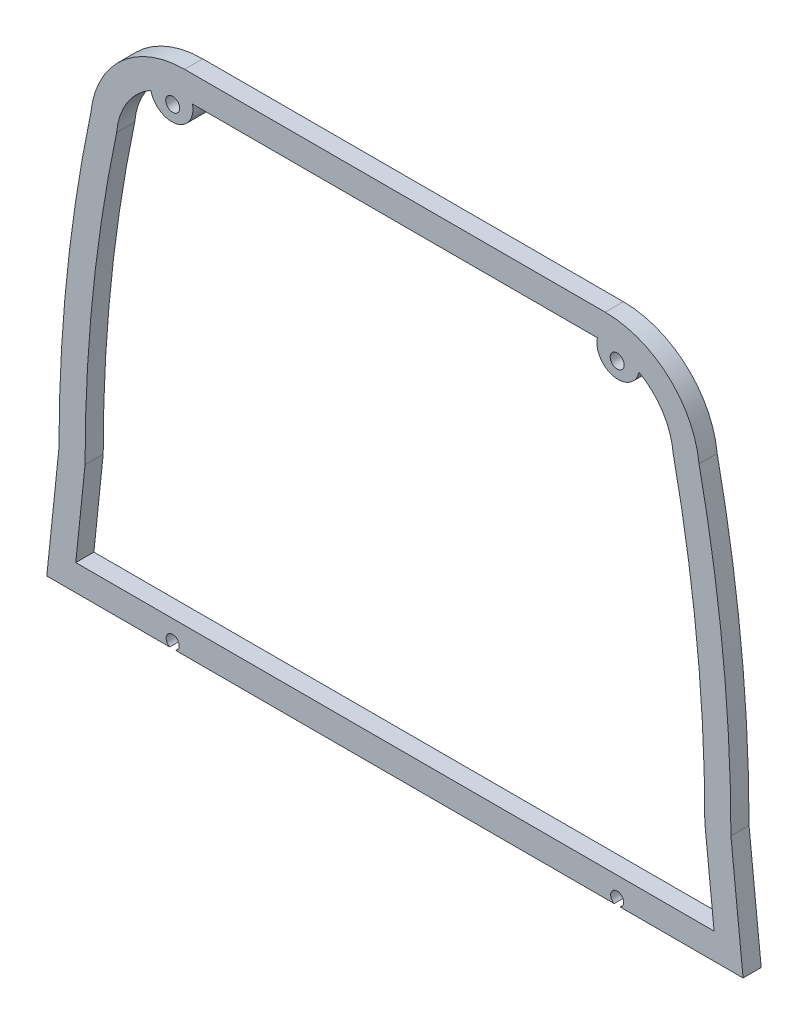
ISO-10303-21;
HEADER;
FILE_DESCRIPTION(('STEP AP214'),'2;1');
FILE_NAME('part.step','',(''),(''),'','','');
FILE_SCHEMA(('AUTOMOTIVE_DESIGN { 1 0 10303 214 1 1 1 1 }'));
ENDSEC;
DATA;
#1=APPLICATION_CONTEXT('core data for automotive mechanical design processes');
#2=APPLICATION_PROTOCOL_DEFINITION('international standard','automotive_design',2000,#1);
#3=PRODUCT_CONTEXT('',#1,'mechanical');
#4=PRODUCT('Part','Part','',(#3));
#5=PRODUCT_RELATED_PRODUCT_CATEGORY('part','',(#4));
#6=PRODUCT_DEFINITION_FORMATION('','',#4);
#7=PRODUCT_DEFINITION_CONTEXT('part definition',#1,'design');
#8=PRODUCT_DEFINITION('design','',#6,#7);
#9=PRODUCT_DEFINITION_SHAPE('','',#8);
#10=(LENGTH_UNIT() NAMED_UNIT(*) SI_UNIT(.MILLI.,.METRE.));
#11=(NAMED_UNIT(*) PLANE_ANGLE_UNIT() SI_UNIT($,.RADIAN.));
#12=(NAMED_UNIT(*) SI_UNIT($,.STERADIAN.) SOLID_ANGLE_UNIT());
#13=UNCERTAINTY_MEASURE_WITH_UNIT(LENGTH_MEASURE(1.E-05),#10,'distance_accuracy_value','');
#14=(GEOMETRIC_REPRESENTATION_CONTEXT(3) GLOBAL_UNCERTAINTY_ASSIGNED_CONTEXT((#13)) GLOBAL_UNIT_ASSIGNED_CONTEXT((#10,
#11,#12)) REPRESENTATION_CONTEXT('',''));
#15=CARTESIAN_POINT('',(0.,0.,0.));
#16=DIRECTION('',(0.,0.,1.));
#17=DIRECTION('',(1.,0.,0.));
#18=AXIS2_PLACEMENT_3D('',#15,#16,#17);
#19=CARTESIAN_POINT('',(0.,-22.225,1.5875));
#20=DIRECTION('',(0.,1.,0.));
#21=DIRECTION('',(-1.,0.,0.));
#22=AXIS2_PLACEMENT_3D('',#19,#20,#21);
#23=PLANE('',#22);
#24=DIRECTION('',(1.,0.,0.));
#25=VECTOR('',#24,1.);
#26=CARTESIAN_POINT('',(0.,-22.225,0.));
#27=LINE('',#26,#25);
#28=CARTESIAN_POINT('',(-30.48,-22.225,0.));
#29=VERTEX_POINT('',#28);
#30=CARTESIAN_POINT('',(-19.719346062449,-22.225,0.));
#31=VERTEX_POINT('',#30);
#32=EDGE_CURVE('E260',#29,#31,#27,.T.);
#33=ORIENTED_EDGE('',*,*,#32,.T.);
#34=DIRECTION('',(0.,0.,-1.));
#35=VECTOR('',#34,1.);
#36=CARTESIAN_POINT('',(-19.719346062449,-22.225,1.5875));
#37=LINE('',#36,#35);
#38=CARTESIAN_POINT('',(-19.719346062449,-22.225,1.5875));
#39=VERTEX_POINT('',#38);
#40=EDGE_CURVE('E11',#39,#31,#37,.T.);
#41=ORIENTED_EDGE('',*,*,#40,.F.);
#42=DIRECTION('',(1.,0.,0.));
#43=VECTOR('',#42,1.);
#44=CARTESIAN_POINT('',(0.,-22.225,1.5875));
#45=LINE('',#44,#43);
#46=CARTESIAN_POINT('',(-30.48,-22.225,1.5875));
#47=VERTEX_POINT('',#46);
#48=EDGE_CURVE('E430',#47,#39,#45,.T.);
#49=ORIENTED_EDGE('',*,*,#48,.F.);
#50=DIRECTION('',(0.,0.,-1.));
#51=VECTOR('',#50,1.);
#52=CARTESIAN_POINT('',(-30.48,-22.225,1.5875));
#53=LINE('',#52,#51);
#54=EDGE_CURVE('E292',#47,#29,#53,.T.);
#55=ORIENTED_EDGE('',*,*,#54,.T.);
#56=EDGE_LOOP('',(#33,#41,#49,#55));
#57=FACE_BOUND('',#56,.T.);
#58=ADVANCED_FACE('F39',(#57),#23,.F.);
#59=CARTESIAN_POINT('',(-19.4575288552222,-21.717,1.5875));
#60=DIRECTION('',(0.,0.,-1.));
#61=DIRECTION('',(-1.,0.,0.));
#62=AXIS2_PLACEMENT_3D('',#59,#60,#61);
#63=CYLINDRICAL_SURFACE('',#62,0.571499999999999);
#64=CARTESIAN_POINT('',(-19.4575288552222,-21.717,0.));
#65=DIRECTION('',(0.,0.,1.));
#66=DIRECTION('',(1.,0.,0.));
#67=AXIS2_PLACEMENT_3D('',#64,#65,#66);
#68=CIRCLE('',#67,0.571499999999999);
#69=CARTESIAN_POINT('',(-19.1957116479955,-22.225,0.));
#70=VERTEX_POINT('',#69);
#71=EDGE_CURVE('E263',#31,#70,#68,.F.);
#72=ORIENTED_EDGE('',*,*,#71,.T.);
#73=DIRECTION('',(0.,0.,-1.));
#74=VECTOR('',#73,1.);
#75=CARTESIAN_POINT('',(-19.1957116479955,-22.225,1.5875));
#76=LINE('',#75,#74);
#77=CARTESIAN_POINT('',(-19.1957116479955,-22.225,1.5875));
#78=VERTEX_POINT('',#77);
#79=EDGE_CURVE('E49',#78,#70,#76,.T.);
#80=ORIENTED_EDGE('',*,*,#79,.F.);
#81=CARTESIAN_POINT('',(-19.4575288552222,-21.717,1.5875));
#82=DIRECTION('',(0.,0.,1.));
#83=DIRECTION('',(1.,0.,0.));
#84=AXIS2_PLACEMENT_3D('',#81,#82,#83);
#85=CIRCLE('',#84,0.571499999999999);
#86=EDGE_CURVE('E628',#39,#78,#85,.F.);
#87=ORIENTED_EDGE('',*,*,#86,.F.);
#88=ORIENTED_EDGE('',*,*,#40,.T.);
#89=EDGE_LOOP('',(#72,#80,#87,#88));
#90=FACE_BOUND('',#89,.T.);
#91=ADVANCED_FACE('F384',(#90),#63,.F.);
#92=CARTESIAN_POINT('',(19.1957116479961,-22.225,0.));
#93=VERTEX_POINT('',#92);
#94=EDGE_CURVE('E265',#70,#93,#27,.T.);
#95=ORIENTED_EDGE('',*,*,#94,.T.);
#96=DIRECTION('',(0.,0.,-1.));
#97=VECTOR('',#96,1.);
#98=CARTESIAN_POINT('',(19.1957116479961,-22.225,1.5875));
#99=LINE('',#98,#97);
#100=CARTESIAN_POINT('',(19.1957116479961,-22.225,1.5875));
#101=VERTEX_POINT('',#100);
#102=EDGE_CURVE('E306',#101,#93,#99,.T.);
#103=ORIENTED_EDGE('',*,*,#102,.F.);
#104=EDGE_CURVE('E429',#78,#101,#45,.T.);
#105=ORIENTED_EDGE('',*,*,#104,.F.);
#106=ORIENTED_EDGE('',*,*,#79,.T.);
#107=EDGE_LOOP('',(#95,#103,#105,#106));
#108=FACE_BOUND('',#107,.T.);
#109=ADVANCED_FACE('F387',(#108),#23,.F.);
#110=CARTESIAN_POINT('',(19.4575288552225,-21.7169999999999,1.5875));
#111=DIRECTION('',(0.,0.,-1.));
#112=DIRECTION('',(-1.,0.,0.));
#113=AXIS2_PLACEMENT_3D('',#110,#111,#112);
#114=CYLINDRICAL_SURFACE('',#113,0.571499999999999);
#115=CARTESIAN_POINT('',(19.4575288552225,-21.7169999999999,0.));
#116=DIRECTION('',(0.,0.,1.));
#117=DIRECTION('',(1.,0.,0.));
#118=AXIS2_PLACEMENT_3D('',#115,#116,#117);
#119=CIRCLE('',#118,0.571499999999999);
#120=CARTESIAN_POINT('',(19.719346062449,-22.225,0.));
#121=VERTEX_POINT('',#120);
#122=EDGE_CURVE('E267',#121,#93,#119,.T.);
#123=ORIENTED_EDGE('',*,*,#122,.F.);
#124=DIRECTION('',(0.,0.,-1.));
#125=VECTOR('',#124,1.);
#126=CARTESIAN_POINT('',(19.719346062449,-22.225,1.5875));
#127=LINE('',#126,#125);
#128=CARTESIAN_POINT('',(19.719346062449,-22.225,1.5875));
#129=VERTEX_POINT('',#128);
#130=EDGE_CURVE('E304',#129,#121,#127,.T.);
#131=ORIENTED_EDGE('',*,*,#130,.F.);
#132=CARTESIAN_POINT('',(19.4575288552225,-21.7169999999999,1.5875));
#133=DIRECTION('',(0.,0.,1.));
#134=DIRECTION('',(1.,0.,0.));
#135=AXIS2_PLACEMENT_3D('',#132,#133,#134);
#136=CIRCLE('',#135,0.571499999999999);
#137=EDGE_CURVE('E427',#129,#101,#136,.T.);
#138=ORIENTED_EDGE('',*,*,#137,.T.);
#139=ORIENTED_EDGE('',*,*,#102,.T.);
#140=EDGE_LOOP('',(#123,#131,#138,#139));
#141=FACE_BOUND('',#140,.T.);
#142=ADVANCED_FACE('F397',(#141),#114,.F.);
#143=CARTESIAN_POINT('',(30.48,-22.225,0.));
#144=VERTEX_POINT('',#143);
#145=EDGE_CURVE('E264',#121,#144,#27,.T.);
#146=ORIENTED_EDGE('',*,*,#145,.T.);
#147=DIRECTION('',(0.,0.,-1.));
#148=VECTOR('',#147,1.);
#149=CARTESIAN_POINT('',(30.48,-22.225,1.5875));
#150=LINE('',#149,#148);
#151=CARTESIAN_POINT('',(30.48,-22.225,1.5875));
#152=VERTEX_POINT('',#151);
#153=EDGE_CURVE('E302',#152,#144,#150,.T.);
#154=ORIENTED_EDGE('',*,*,#153,.F.);
#155=EDGE_CURVE('E423',#129,#152,#45,.T.);
#156=ORIENTED_EDGE('',*,*,#155,.F.);
#157=ORIENTED_EDGE('',*,*,#130,.T.);
#158=EDGE_LOOP('',(#146,#154,#156,#157));
#159=FACE_BOUND('',#158,.T.);
#160=ADVANCED_FACE('F388',(#159),#23,.F.);
#161=CARTESIAN_POINT('',(33.9266046391579,-55.3551368247313,1.5875));
#162=DIRECTION('',(0.994632171119737,0.103473881601294,0.));
#163=DIRECTION('',(-0.103473881601294,0.994632171119737,0.));
#164=AXIS2_PLACEMENT_3D('',#161,#162,#163);
#165=PLANE('',#164);
#166=DIRECTION('',(0.103473881601294,-0.994632171119737,0.));
#167=VECTOR('',#166,1.);
#168=CARTESIAN_POINT('',(33.9266046391579,-55.3551368247313,0.));
#169=LINE('',#168,#167);
#170=CARTESIAN_POINT('',(29.4151044762057,-11.9887999999999,0.));
#171=VERTEX_POINT('',#170);
#172=EDGE_CURVE('E270',#171,#144,#169,.T.);
#173=ORIENTED_EDGE('',*,*,#172,.F.);
#174=DIRECTION('',(0.,0.,-1.));
#175=VECTOR('',#174,1.);
#176=CARTESIAN_POINT('',(29.4151044762057,-11.9887999999999,1.5875));
#177=LINE('',#176,#175);
#178=CARTESIAN_POINT('',(29.4151044762057,-11.9887999999999,1.5875));
#179=VERTEX_POINT('',#178);
#180=EDGE_CURVE('E300',#179,#171,#177,.T.);
#181=ORIENTED_EDGE('',*,*,#180,.F.);
#182=DIRECTION('',(0.103473881601294,-0.994632171119737,0.));
#183=VECTOR('',#182,1.);
#184=CARTESIAN_POINT('',(33.9266046391579,-55.3551368247313,1.5875));
#185=LINE('',#184,#183);
#186=EDGE_CURVE('E421',#179,#152,#185,.T.);
#187=ORIENTED_EDGE('',*,*,#186,.T.);
#188=ORIENTED_EDGE('',*,*,#153,.T.);
#189=EDGE_LOOP('',(#173,#181,#187,#188));
#190=FACE_BOUND('',#189,.T.);
#191=ADVANCED_FACE('F400',(#190),#165,.T.);
#192=CARTESIAN_POINT('',(-100.848111200307,-11.9888000000008,1.5875));
#193=DIRECTION('',(0.,0.,-1.));
#194=DIRECTION('',(-1.,0.,0.));
#195=AXIS2_PLACEMENT_3D('',#192,#193,#194);
#196=CYLINDRICAL_SURFACE('',#195,130.263215676513);
#197=CARTESIAN_POINT('',(-100.848111200307,-11.9888000000008,0.));
#198=DIRECTION('',(0.,0.,1.));
#199=DIRECTION('',(1.,0.,0.));
#200=AXIS2_PLACEMENT_3D('',#197,#198,#199);
#201=CIRCLE('',#200,130.263215676513);
#202=CARTESIAN_POINT('',(26.6256885725934,14.824176892619,0.));
#203=VERTEX_POINT('',#202);
#204=EDGE_CURVE('E273',#171,#203,#201,.T.);
#205=ORIENTED_EDGE('',*,*,#204,.T.);
#206=DIRECTION('',(0.,0.,-1.));
#207=VECTOR('',#206,1.);
#208=CARTESIAN_POINT('',(26.6256885725934,14.824176892619,1.5875));
#209=LINE('',#208,#207);
#210=CARTESIAN_POINT('',(26.6256885725934,14.824176892619,1.5875));
#211=VERTEX_POINT('',#210);
#212=EDGE_CURVE('E298',#211,#203,#209,.T.);
#213=ORIENTED_EDGE('',*,*,#212,.F.);
#214=CARTESIAN_POINT('',(-100.848111200307,-11.9888000000008,1.5875));
#215=DIRECTION('',(0.,0.,1.));
#216=DIRECTION('',(1.,0.,0.));
#217=AXIS2_PLACEMENT_3D('',#214,#215,#216);
#218=CIRCLE('',#217,130.263215676513);
#219=EDGE_CURVE('E422',#179,#211,#218,.T.);
#220=ORIENTED_EDGE('',*,*,#219,.F.);
#221=ORIENTED_EDGE('',*,*,#180,.T.);
#222=EDGE_LOOP('',(#205,#213,#220,#221));
#223=FACE_BOUND('',#222,.T.);
#224=ADVANCED_FACE('F406',(#223),#196,.T.);
#225=CARTESIAN_POINT('',(18.415,13.97,1.5875));
#226=DIRECTION('',(0.,0.,-1.));
#227=DIRECTION('',(-1.,0.,0.));
#228=AXIS2_PLACEMENT_3D('',#225,#226,#227);
#229=CYLINDRICAL_SURFACE('',#228,8.25500000000002);
#230=CARTESIAN_POINT('',(18.415,13.97,0.));
#231=DIRECTION('',(0.,0.,1.));
#232=DIRECTION('',(1.,0.,0.));
#233=AXIS2_PLACEMENT_3D('',#230,#231,#232);
#234=CIRCLE('',#233,8.25500000000002);
#235=CARTESIAN_POINT('',(18.415,22.225,0.));
#236=VERTEX_POINT('',#235);
#237=EDGE_CURVE('E276',#236,#203,#234,.F.);
#238=ORIENTED_EDGE('',*,*,#237,.F.);
#239=DIRECTION('',(0.,0.,-1.));
#240=VECTOR('',#239,1.);
#241=CARTESIAN_POINT('',(18.415,22.225,1.5875));
#242=LINE('',#241,#240);
#243=CARTESIAN_POINT('',(18.415,22.225,1.5875));
#244=VERTEX_POINT('',#243);
#245=EDGE_CURVE('E296',#244,#236,#242,.T.);
#246=ORIENTED_EDGE('',*,*,#245,.F.);
#247=CARTESIAN_POINT('',(18.415,13.97,1.5875));
#248=DIRECTION('',(0.,0.,1.));
#249=DIRECTION('',(1.,0.,0.));
#250=AXIS2_PLACEMENT_3D('',#247,#248,#249);
#251=CIRCLE('',#250,8.25500000000002);
#252=EDGE_CURVE('E425',#244,#211,#251,.F.);
#253=ORIENTED_EDGE('',*,*,#252,.T.);
#254=ORIENTED_EDGE('',*,*,#212,.T.);
#255=EDGE_LOOP('',(#238,#246,#253,#254));
#256=FACE_BOUND('',#255,.T.);
#257=ADVANCED_FACE('F437',(#256),#229,.T.);
#258=CARTESIAN_POINT('',(0.,22.225,1.5875));
#259=DIRECTION('',(0.,-1.,0.));
#260=DIRECTION('',(1.,0.,0.));
#261=AXIS2_PLACEMENT_3D('',#258,#259,#260);
#262=PLANE('',#261);
#263=DIRECTION('',(-1.,0.,0.));
#264=VECTOR('',#263,1.);
#265=CARTESIAN_POINT('',(0.,22.225,0.));
#266=LINE('',#265,#264);
#267=CARTESIAN_POINT('',(-18.415,22.225,0.));
#268=VERTEX_POINT('',#267);
#269=EDGE_CURVE('E279',#236,#268,#266,.T.);
#270=ORIENTED_EDGE('',*,*,#269,.T.);
#271=DIRECTION('',(0.,0.,-1.));
#272=VECTOR('',#271,1.);
#273=CARTESIAN_POINT('',(-18.415,22.225,1.5875));
#274=LINE('',#273,#272);
#275=CARTESIAN_POINT('',(-18.415,22.225,1.5875));
#276=VERTEX_POINT('',#275);
#277=EDGE_CURVE('E216',#276,#268,#274,.T.);
#278=ORIENTED_EDGE('',*,*,#277,.F.);
#279=DIRECTION('',(-1.,0.,0.));
#280=VECTOR('',#279,1.);
#281=CARTESIAN_POINT('',(0.,22.225,1.5875));
#282=LINE('',#281,#280);
#283=EDGE_CURVE('E203',#244,#276,#282,.T.);
#284=ORIENTED_EDGE('',*,*,#283,.F.);
#285=ORIENTED_EDGE('',*,*,#245,.T.);
#286=EDGE_LOOP('',(#270,#278,#284,#285));
#287=FACE_BOUND('',#286,.T.);
#288=ADVANCED_FACE('F442',(#287),#262,.F.);
#289=CARTESIAN_POINT('',(-18.415,13.97,1.5875));
#290=DIRECTION('',(0.,0.,-1.));
#291=DIRECTION('',(-1.,0.,0.));
#292=AXIS2_PLACEMENT_3D('',#289,#290,#291);
#293=CYLINDRICAL_SURFACE('',#292,8.255);
#294=CARTESIAN_POINT('',(-18.415,13.97,0.));
#295=DIRECTION('',(0.,0.,1.));
#296=DIRECTION('',(1.,0.,0.));
#297=AXIS2_PLACEMENT_3D('',#294,#295,#296);
#298=CIRCLE('',#297,8.255);
#299=CARTESIAN_POINT('',(-26.6256885725934,14.8241768926189,0.));
#300=VERTEX_POINT('',#299);
#301=EDGE_CURVE('E212',#268,#300,#298,.T.);
#302=ORIENTED_EDGE('',*,*,#301,.T.);
#303=DIRECTION('',(0.,0.,-1.));
#304=VECTOR('',#303,1.);
#305=CARTESIAN_POINT('',(-26.6256885725934,14.8241768926189,1.5875));
#306=LINE('',#305,#304);
#307=CARTESIAN_POINT('',(-26.6256885725934,14.8241768926189,1.5875));
#308=VERTEX_POINT('',#307);
#309=EDGE_CURVE('E209',#308,#300,#306,.T.);
#310=ORIENTED_EDGE('',*,*,#309,.F.);
#311=CARTESIAN_POINT('',(-18.415,13.97,1.5875));
#312=DIRECTION('',(0.,0.,1.));
#313=DIRECTION('',(1.,0.,0.));
#314=AXIS2_PLACEMENT_3D('',#311,#312,#313);
#315=CIRCLE('',#314,8.255);
#316=EDGE_CURVE('E195',#276,#308,#315,.T.);
#317=ORIENTED_EDGE('',*,*,#316,.F.);
#318=ORIENTED_EDGE('',*,*,#277,.T.);
#319=EDGE_LOOP('',(#302,#310,#317,#318));
#320=FACE_BOUND('',#319,.T.);
#321=ADVANCED_FACE('F210',(#320),#293,.T.);
#322=CARTESIAN_POINT('',(100.848111200307,-11.9888000000001,1.5875));
#323=DIRECTION('',(0.,0.,-1.));
#324=DIRECTION('',(-1.,0.,0.));
#325=AXIS2_PLACEMENT_3D('',#322,#323,#324);
#326=CYLINDRICAL_SURFACE('',#325,130.263215676513);
#327=CARTESIAN_POINT('',(100.848111200307,-11.9888000000001,0.));
#328=DIRECTION('',(0.,0.,1.));
#329=DIRECTION('',(1.,0.,0.));
#330=AXIS2_PLACEMENT_3D('',#327,#328,#329);
#331=CIRCLE('',#330,130.263215676513);
#332=CARTESIAN_POINT('',(-29.4151044762055,-11.9888000000001,0.));
#333=VERTEX_POINT('',#332);
#334=EDGE_CURVE('E282',#333,#300,#331,.F.);
#335=ORIENTED_EDGE('',*,*,#334,.F.);
#336=DIRECTION('',(0.,0.,-1.));
#337=VECTOR('',#336,1.);
#338=CARTESIAN_POINT('',(-29.4151044762055,-11.9888000000001,1.5875));
#339=LINE('',#338,#337);
#340=CARTESIAN_POINT('',(-29.4151044762055,-11.9888000000001,1.5875));
#341=VERTEX_POINT('',#340);
#342=EDGE_CURVE('E128',#341,#333,#339,.T.);
#343=ORIENTED_EDGE('',*,*,#342,.F.);
#344=CARTESIAN_POINT('',(100.848111200307,-11.9888000000001,1.5875));
#345=DIRECTION('',(0.,0.,1.));
#346=DIRECTION('',(1.,0.,0.));
#347=AXIS2_PLACEMENT_3D('',#344,#345,#346);
#348=CIRCLE('',#347,130.263215676513);
#349=EDGE_CURVE('E200',#341,#308,#348,.F.);
#350=ORIENTED_EDGE('',*,*,#349,.T.);
#351=ORIENTED_EDGE('',*,*,#309,.T.);
#352=EDGE_LOOP('',(#335,#343,#350,#351));
#353=FACE_BOUND('',#352,.T.);
#354=ADVANCED_FACE('F218',(#353),#326,.T.);
#355=CARTESIAN_POINT('',(-18.415,13.97,1.5875));
#356=DIRECTION('',(0.,0.,-1.));
#357=DIRECTION('',(-1.,0.,0.));
#358=AXIS2_PLACEMENT_3D('',#355,#356,#357);
#359=CYLINDRICAL_SURFACE('',#358,5.96900000000001);
#360=CARTESIAN_POINT('',(-18.415,13.97,0.));
#361=DIRECTION('',(0.,0.,1.));
#362=DIRECTION('',(1.,0.,0.));
#363=AXIS2_PLACEMENT_3D('',#360,#361,#362);
#364=CIRCLE('',#363,5.96900000000001);
#365=CARTESIAN_POINT('',(-21.365471992299,19.1588029469868,0.));
#366=VERTEX_POINT('',#365);
#367=CARTESIAN_POINT('',(-24.3622943207271,14.4785776859514,0.));
#368=VERTEX_POINT('',#367);
#369=EDGE_CURVE('E230',#366,#368,#364,.T.);
#370=ORIENTED_EDGE('',*,*,#369,.F.);
#371=DIRECTION('',(0.,0.,-1.));
#372=VECTOR('',#371,1.);
#373=CARTESIAN_POINT('',(-21.365471992299,19.1588029469868,1.5875));
#374=LINE('',#373,#372);
#375=CARTESIAN_POINT('',(-21.365471992299,19.1588029469868,1.5875));
#376=VERTEX_POINT('',#375);
#377=EDGE_CURVE('E43',#376,#366,#374,.T.);
#378=ORIENTED_EDGE('',*,*,#377,.F.);
#379=CARTESIAN_POINT('',(-18.415,13.97,1.5875));
#380=DIRECTION('',(0.,0.,1.));
#381=DIRECTION('',(1.,0.,0.));
#382=AXIS2_PLACEMENT_3D('',#379,#380,#381);
#383=CIRCLE('',#382,5.96900000000001);
#384=CARTESIAN_POINT('',(-24.3622943207271,14.4785776859514,1.5875));
#385=VERTEX_POINT('',#384);
#386=EDGE_CURVE('E291',#376,#385,#383,.T.);
#387=ORIENTED_EDGE('',*,*,#386,.T.);
#388=DIRECTION('',(0.,0.,-1.));
#389=VECTOR('',#388,1.);
#390=CARTESIAN_POINT('',(-24.3622943207271,14.4785776859514,1.5875));
#391=LINE('',#390,#389);
#392=EDGE_CURVE('E229',#385,#368,#391,.T.);
#393=ORIENTED_EDGE('',*,*,#392,.T.);
#394=EDGE_LOOP('',(#370,#378,#387,#393));
#395=FACE_BOUND('',#394,.T.);
#396=ADVANCED_FACE('F41',(#395),#359,.F.);
#397=CARTESIAN_POINT('',(-19.545370171903,19.5489014734934,1.5875));
#398=DIRECTION('',(0.,0.,-1.));
#399=DIRECTION('',(-1.,0.,0.));
#400=AXIS2_PLACEMENT_3D('',#397,#398,#399);
#401=CYLINDRICAL_SURFACE('',#400,1.86143694413519);
#402=CARTESIAN_POINT('',(-19.545370171903,19.5489014734934,0.));
#403=DIRECTION('',(0.,0.,1.));
#404=DIRECTION('',(1.,0.,0.));
#405=AXIS2_PLACEMENT_3D('',#402,#403,#404);
#406=CIRCLE('',#405,1.86143694413519);
#407=CARTESIAN_POINT('',(-17.7252683515071,19.939,0.));
#408=VERTEX_POINT('',#407);
#409=EDGE_CURVE('E233',#366,#408,#406,.T.);
#410=ORIENTED_EDGE('',*,*,#409,.T.);
#411=DIRECTION('',(0.,0.,-1.));
#412=VECTOR('',#411,1.);
#413=CARTESIAN_POINT('',(-17.7252683515071,19.939,1.5875));
#414=LINE('',#413,#412);
#415=CARTESIAN_POINT('',(-17.7252683515071,19.939,1.5875));
#416=VERTEX_POINT('',#415);
#417=EDGE_CURVE('E324',#416,#408,#414,.T.);
#418=ORIENTED_EDGE('',*,*,#417,.F.);
#419=CARTESIAN_POINT('',(-19.545370171903,19.5489014734934,1.5875));
#420=DIRECTION('',(0.,0.,1.));
#421=DIRECTION('',(1.,0.,0.));
#422=AXIS2_PLACEMENT_3D('',#419,#420,#421);
#423=CIRCLE('',#422,1.86143694413519);
#424=EDGE_CURVE('E332',#376,#416,#423,.T.);
#425=ORIENTED_EDGE('',*,*,#424,.F.);
#426=ORIENTED_EDGE('',*,*,#377,.T.);
#427=EDGE_LOOP('',(#410,#418,#425,#426));
#428=FACE_BOUND('',#427,.T.);
#429=ADVANCED_FACE('F331',(#428),#401,.T.);
#430=CARTESIAN_POINT('',(0.,19.939,1.5875));
#431=DIRECTION('',(0.,-1.,0.));
#432=DIRECTION('',(1.,0.,0.));
#433=AXIS2_PLACEMENT_3D('',#430,#431,#432);
#434=PLANE('',#433);
#435=DIRECTION('',(-1.,0.,0.));
#436=VECTOR('',#435,1.);
#437=CARTESIAN_POINT('',(0.,19.939,0.));
#438=LINE('',#437,#436);
#439=CARTESIAN_POINT('',(17.725268351507,19.939,0.));
#440=VERTEX_POINT('',#439);
#441=EDGE_CURVE('E236',#440,#408,#438,.T.);
#442=ORIENTED_EDGE('',*,*,#441,.F.);
#443=DIRECTION('',(0.,0.,-1.));
#444=VECTOR('',#443,1.);
#445=CARTESIAN_POINT('',(17.725268351507,19.939,1.5875));
#446=LINE('',#445,#444);
#447=CARTESIAN_POINT('',(17.725268351507,19.939,1.5875));
#448=VERTEX_POINT('',#447);
#449=EDGE_CURVE('E323',#448,#440,#446,.T.);
#450=ORIENTED_EDGE('',*,*,#449,.F.);
#451=DIRECTION('',(-1.,0.,0.));
#452=VECTOR('',#451,1.);
#453=CARTESIAN_POINT('',(0.,19.939,1.5875));
#454=LINE('',#453,#452);
#455=EDGE_CURVE('E615',#448,#416,#454,.T.);
#456=ORIENTED_EDGE('',*,*,#455,.T.);
#457=ORIENTED_EDGE('',*,*,#417,.T.);
#458=EDGE_LOOP('',(#442,#450,#456,#457));
#459=FACE_BOUND('',#458,.T.);
#460=ADVANCED_FACE('F375',(#459),#434,.T.);
#461=CARTESIAN_POINT('',(19.545370171903,19.5489014734936,1.5875));
#462=DIRECTION('',(0.,0.,-1.));
#463=DIRECTION('',(-1.,0.,0.));
#464=AXIS2_PLACEMENT_3D('',#461,#462,#463);
#465=CYLINDRICAL_SURFACE('',#464,1.86143694413519);
#466=CARTESIAN_POINT('',(19.545370171903,19.5489014734936,0.));
#467=DIRECTION('',(0.,0.,1.));
#468=DIRECTION('',(1.,0.,0.));
#469=AXIS2_PLACEMENT_3D('',#466,#467,#468);
#470=CIRCLE('',#469,1.86143694413519);
#471=CARTESIAN_POINT('',(21.365471992299,19.1588029469869,0.));
#472=VERTEX_POINT('',#471);
#473=EDGE_CURVE('E239',#472,#440,#470,.F.);
#474=ORIENTED_EDGE('',*,*,#473,.F.);
#475=DIRECTION('',(0.,0.,-1.));
#476=VECTOR('',#475,1.);
#477=CARTESIAN_POINT('',(21.365471992299,19.1588029469869,1.5875));
#478=LINE('',#477,#476);
#479=CARTESIAN_POINT('',(21.365471992299,19.1588029469869,1.5875));
#480=VERTEX_POINT('',#479);
#481=EDGE_CURVE('E321',#480,#472,#478,.T.);
#482=ORIENTED_EDGE('',*,*,#481,.F.);
#483=CARTESIAN_POINT('',(19.545370171903,19.5489014734936,1.5875));
#484=DIRECTION('',(0.,0.,1.));
#485=DIRECTION('',(1.,0.,0.));
#486=AXIS2_PLACEMENT_3D('',#483,#484,#485);
#487=CIRCLE('',#486,1.86143694413519);
#488=EDGE_CURVE('E373',#480,#448,#487,.F.);
#489=ORIENTED_EDGE('',*,*,#488,.T.);
#490=ORIENTED_EDGE('',*,*,#449,.T.);
#491=EDGE_LOOP('',(#474,#482,#489,#490));
#492=FACE_BOUND('',#491,.T.);
#493=ADVANCED_FACE('F370',(#492),#465,.T.);
#494=CARTESIAN_POINT('',(18.415,13.97,1.5875));
#495=DIRECTION('',(0.,0.,-1.));
#496=DIRECTION('',(-1.,0.,0.));
#497=AXIS2_PLACEMENT_3D('',#494,#495,#496);
#498=CYLINDRICAL_SURFACE('',#497,5.96900000000002);
#499=CARTESIAN_POINT('',(18.415,13.97,0.));
#500=DIRECTION('',(0.,0.,1.));
#501=DIRECTION('',(1.,0.,0.));
#502=AXIS2_PLACEMENT_3D('',#499,#500,#501);
#503=CIRCLE('',#502,5.96900000000002);
#504=CARTESIAN_POINT('',(24.362294320727,14.4785776859518,0.));
#505=VERTEX_POINT('',#504);
#506=EDGE_CURVE('E242',#472,#505,#503,.F.);
#507=ORIENTED_EDGE('',*,*,#506,.T.);
#508=DIRECTION('',(0.,0.,-1.));
#509=VECTOR('',#508,1.);
#510=CARTESIAN_POINT('',(24.362294320727,14.4785776859518,1.5875));
#511=LINE('',#510,#509);
#512=CARTESIAN_POINT('',(24.362294320727,14.4785776859518,1.5875));
#513=VERTEX_POINT('',#512);
#514=EDGE_CURVE('E319',#513,#505,#511,.T.);
#515=ORIENTED_EDGE('',*,*,#514,.F.);
#516=CARTESIAN_POINT('',(18.415,13.97,1.5875));
#517=DIRECTION('',(0.,0.,1.));
#518=DIRECTION('',(1.,0.,0.));
#519=AXIS2_PLACEMENT_3D('',#516,#517,#518);
#520=CIRCLE('',#519,5.96900000000002);
#521=EDGE_CURVE('E620',#480,#513,#520,.F.);
#522=ORIENTED_EDGE('',*,*,#521,.F.);
#523=ORIENTED_EDGE('',*,*,#481,.T.);
#524=EDGE_LOOP('',(#507,#515,#522,#523));
#525=FACE_BOUND('',#524,.T.);
#526=ADVANCED_FACE('F367',(#525),#498,.F.);
#527=CARTESIAN_POINT('',(-100.848111200307,-11.9888000000008,1.5875));
#528=DIRECTION('',(0.,0.,-1.));
#529=DIRECTION('',(-1.,0.,0.));
#530=AXIS2_PLACEMENT_3D('',#527,#528,#529);
#531=CYLINDRICAL_SURFACE('',#530,127.977215676513);
#532=CARTESIAN_POINT('',(-100.848111200307,-11.9888000000008,0.));
#533=DIRECTION('',(0.,0.,1.));
#534=DIRECTION('',(1.,0.,0.));
#535=AXIS2_PLACEMENT_3D('',#532,#533,#534);
#536=CIRCLE('',#535,127.977215676513);
#537=CARTESIAN_POINT('',(27.1290500155386,-12.1068654315829,0.));
#538=VERTEX_POINT('',#537);
#539=EDGE_CURVE('E245',#538,#505,#536,.T.);
#540=ORIENTED_EDGE('',*,*,#539,.F.);
#541=DIRECTION('',(0.,0.,-1.));
#542=VECTOR('',#541,1.);
#543=CARTESIAN_POINT('',(27.1290500155386,-12.1068654315829,1.5875));
#544=LINE('',#543,#542);
#545=CARTESIAN_POINT('',(27.1290500155386,-12.1068654315829,1.5875));
#546=VERTEX_POINT('',#545);
#547=EDGE_CURVE('E317',#546,#538,#544,.T.);
#548=ORIENTED_EDGE('',*,*,#547,.F.);
#549=CARTESIAN_POINT('',(-100.848111200307,-11.9888000000008,1.5875));
#550=DIRECTION('',(0.,0.,1.));
#551=DIRECTION('',(1.,0.,0.));
#552=AXIS2_PLACEMENT_3D('',#549,#550,#551);
#553=CIRCLE('',#552,127.977215676513);
#554=EDGE_CURVE('E364',#546,#513,#553,.T.);
#555=ORIENTED_EDGE('',*,*,#554,.T.);
#556=ORIENTED_EDGE('',*,*,#514,.T.);
#557=EDGE_LOOP('',(#540,#548,#555,#556));
#558=FACE_BOUND('',#557,.T.);
#559=ADVANCED_FACE('F359',(#558),#531,.F.);
#560=CARTESIAN_POINT('',(31.6528754959786,-55.5916781180713,1.5875));
#561=DIRECTION('',(0.994632171119735,0.103473881601311,0.));
#562=DIRECTION('',(-0.103473881601311,0.994632171119735,0.));
#563=AXIS2_PLACEMENT_3D('',#560,#561,#562);
#564=PLANE('',#563);
#565=DIRECTION('',(0.103473881601311,-0.994632171119735,0.));
#566=VECTOR('',#565,1.);
#567=CARTESIAN_POINT('',(31.6528754959786,-55.5916781180713,0.));
#568=LINE('',#567,#566);
#569=CARTESIAN_POINT('',(27.9438450609326,-19.939,0.));
#570=VERTEX_POINT('',#569);
#571=EDGE_CURVE('E248',#538,#570,#568,.T.);
#572=ORIENTED_EDGE('',*,*,#571,.T.);
#573=DIRECTION('',(0.,0.,-1.));
#574=VECTOR('',#573,1.);
#575=CARTESIAN_POINT('',(27.9438450609326,-19.939,1.5875));
#576=LINE('',#575,#574);
#577=CARTESIAN_POINT('',(27.9438450609326,-19.939,1.5875));
#578=VERTEX_POINT('',#577);
#579=EDGE_CURVE('E315',#578,#570,#576,.T.);
#580=ORIENTED_EDGE('',*,*,#579,.F.);
#581=DIRECTION('',(0.103473881601311,-0.994632171119735,0.));
#582=VECTOR('',#581,1.);
#583=CARTESIAN_POINT('',(31.6528754959786,-55.5916781180713,1.5875));
#584=LINE('',#583,#582);
#585=EDGE_CURVE('E623',#546,#578,#584,.T.);
#586=ORIENTED_EDGE('',*,*,#585,.F.);
#587=ORIENTED_EDGE('',*,*,#547,.T.);
#588=EDGE_LOOP('',(#572,#580,#586,#587));
#589=FACE_BOUND('',#588,.T.);
#590=ADVANCED_FACE('F519',(#589),#564,.F.);
#591=CARTESIAN_POINT('',(0.,-19.939,1.5875));
#592=DIRECTION('',(0.,1.,0.));
#593=DIRECTION('',(0.,0.,1.));
#594=AXIS2_PLACEMENT_3D('',#591,#592,#593);
#595=PLANE('',#594);
#596=DIRECTION('',(1.,0.,0.));
#597=VECTOR('',#596,1.);
#598=CARTESIAN_POINT('',(0.,-19.939,0.));
#599=LINE('',#598,#597);
#600=CARTESIAN_POINT('',(-27.9438450609326,-19.939,0.));
#601=VERTEX_POINT('',#600);
#602=EDGE_CURVE('E251',#601,#570,#599,.T.);
#603=ORIENTED_EDGE('',*,*,#602,.F.);
#604=DIRECTION('',(0.,0.,-1.));
#605=VECTOR('',#604,1.);
#606=CARTESIAN_POINT('',(-27.9438450609326,-19.939,1.5875));
#607=LINE('',#606,#605);
#608=CARTESIAN_POINT('',(-27.9438450609326,-19.939,1.5875));
#609=VERTEX_POINT('',#608);
#610=EDGE_CURVE('E313',#609,#601,#607,.T.);
#611=ORIENTED_EDGE('',*,*,#610,.F.);
#612=DIRECTION('',(1.,0.,0.));
#613=VECTOR('',#612,1.);
#614=CARTESIAN_POINT('',(0.,-19.939,1.5875));
#615=LINE('',#614,#613);
#616=EDGE_CURVE('E625',#609,#578,#615,.T.);
#617=ORIENTED_EDGE('',*,*,#616,.T.);
#618=ORIENTED_EDGE('',*,*,#579,.T.);
#619=EDGE_LOOP('',(#603,#611,#617,#618));
#620=FACE_BOUND('',#619,.T.);
#621=ADVANCED_FACE('F352',(#620),#595,.T.);
#622=CARTESIAN_POINT('',(-31.6528754959786,-55.5916781180713,1.5875));
#623=DIRECTION('',(0.994632171119735,-0.103473881601311,0.));
#624=DIRECTION('',(0.103473881601311,0.994632171119735,0.));
#625=AXIS2_PLACEMENT_3D('',#622,#623,#624);
#626=PLANE('',#625);
#627=DIRECTION('',(-0.103473881601311,-0.994632171119735,0.));
#628=VECTOR('',#627,1.);
#629=CARTESIAN_POINT('',(-31.6528754959786,-55.5916781180713,0.));
#630=LINE('',#629,#628);
#631=CARTESIAN_POINT('',(-27.1290500155383,-12.1068654315809,0.));
#632=VERTEX_POINT('',#631);
#633=EDGE_CURVE('E254',#632,#601,#630,.T.);
#634=ORIENTED_EDGE('',*,*,#633,.F.);
#635=DIRECTION('',(0.,0.,-1.));
#636=VECTOR('',#635,1.);
#637=CARTESIAN_POINT('',(-27.1290500155383,-12.1068654315809,1.5875));
#638=LINE('',#637,#636);
#639=CARTESIAN_POINT('',(-27.1290500155383,-12.1068654315809,1.5875));
#640=VERTEX_POINT('',#639);
#641=EDGE_CURVE('E311',#640,#632,#638,.T.);
#642=ORIENTED_EDGE('',*,*,#641,.F.);
#643=DIRECTION('',(-0.103473881601311,-0.994632171119735,0.));
#644=VECTOR('',#643,1.);
#645=CARTESIAN_POINT('',(-31.6528754959786,-55.5916781180713,1.5875));
#646=LINE('',#645,#644);
#647=EDGE_CURVE('E348',#640,#609,#646,.T.);
#648=ORIENTED_EDGE('',*,*,#647,.T.);
#649=ORIENTED_EDGE('',*,*,#610,.T.);
#650=EDGE_LOOP('',(#634,#642,#648,#649));
#651=FACE_BOUND('',#650,.T.);
#652=ADVANCED_FACE('F344',(#651),#626,.T.);
#653=CARTESIAN_POINT('',(19.4575288552221,19.05,1.5875));
#654=DIRECTION('',(0.,0.,-1.));
#655=DIRECTION('',(-1.,0.,0.));
#656=AXIS2_PLACEMENT_3D('',#653,#654,#655);
#657=CYLINDRICAL_SURFACE('',#656,0.609599999999999);
#658=CARTESIAN_POINT('',(19.4575288552221,19.05,1.5875));
#659=DIRECTION('',(0.,0.,1.));
#660=DIRECTION('',(1.,0.,0.));
#661=AXIS2_PLACEMENT_3D('',#658,#659,#660);
#662=CIRCLE('',#661,0.609599999999999);
#663=CARTESIAN_POINT('',(20.0671288552221,19.05,1.5875));
#664=VERTEX_POINT('',#663);
#665=EDGE_CURVE('E220',#664,#664,#662,.F.);
#666=ORIENTED_EDGE('',*,*,#665,.F.);
#667=EDGE_LOOP('',(#666));
#668=FACE_BOUND('',#667,.T.);
#669=CARTESIAN_POINT('',(19.4575288552221,19.05,0.));
#670=DIRECTION('',(0.,0.,1.));
#671=DIRECTION('',(1.,0.,0.));
#672=AXIS2_PLACEMENT_3D('',#669,#670,#671);
#673=CIRCLE('',#672,0.609599999999999);
#674=CARTESIAN_POINT('',(20.0671288552221,19.05,0.));
#675=VERTEX_POINT('',#674);
#676=EDGE_CURVE('E285',#675,#675,#673,.F.);
#677=ORIENTED_EDGE('',*,*,#676,.T.);
#678=EDGE_LOOP('',(#677));
#679=FACE_BOUND('',#678,.T.);
#680=ADVANCED_FACE('F544',(#668,#679),#657,.F.);
#681=CARTESIAN_POINT('',(-33.9266046391585,-55.3551368247306,1.5875));
#682=DIRECTION('',(0.994632171119734,-0.103473881601315,0.));
#683=DIRECTION('',(0.103473881601315,0.994632171119735,0.));
#684=AXIS2_PLACEMENT_3D('',#681,#682,#683);
#685=PLANE('',#684);
#686=DIRECTION('',(-0.103473881601315,-0.994632171119735,0.));
#687=VECTOR('',#686,1.);
#688=CARTESIAN_POINT('',(-33.9266046391585,-55.3551368247306,0.));
#689=LINE('',#688,#687);
#690=EDGE_CURVE('E131',#333,#29,#689,.T.);
#691=ORIENTED_EDGE('',*,*,#690,.T.);
#692=ORIENTED_EDGE('',*,*,#54,.F.);
#693=DIRECTION('',(-0.103473881601315,-0.994632171119735,0.));
#694=VECTOR('',#693,1.);
#695=CARTESIAN_POINT('',(-33.9266046391585,-55.3551368247306,1.5875));
#696=LINE('',#695,#694);
#697=EDGE_CURVE('E58',#341,#47,#696,.T.);
#698=ORIENTED_EDGE('',*,*,#697,.F.);
#699=ORIENTED_EDGE('',*,*,#342,.T.);
#700=EDGE_LOOP('',(#691,#692,#698,#699));
#701=FACE_BOUND('',#700,.T.);
#702=ADVANCED_FACE('F553',(#701),#685,.F.);
#703=CARTESIAN_POINT('',(100.848111200307,-11.9888000000001,1.5875));
#704=DIRECTION('',(0.,0.,-1.));
#705=DIRECTION('',(-1.,0.,0.));
#706=AXIS2_PLACEMENT_3D('',#703,#704,#705);
#707=CYLINDRICAL_SURFACE('',#706,127.977215676513);
#708=CARTESIAN_POINT('',(100.848111200307,-11.9888000000001,0.));
#709=DIRECTION('',(0.,0.,1.));
#710=DIRECTION('',(1.,0.,0.));
#711=AXIS2_PLACEMENT_3D('',#708,#709,#710);
#712=CIRCLE('',#711,127.977215676513);
#713=EDGE_CURVE('E257',#632,#368,#712,.F.);
#714=ORIENTED_EDGE('',*,*,#713,.T.);
#715=ORIENTED_EDGE('',*,*,#392,.F.);
#716=CARTESIAN_POINT('',(100.848111200307,-11.9888000000001,1.5875));
#717=DIRECTION('',(0.,0.,1.));
#718=DIRECTION('',(1.,0.,0.));
#719=AXIS2_PLACEMENT_3D('',#716,#717,#718);
#720=CIRCLE('',#719,127.977215676513);
#721=EDGE_CURVE('E613',#640,#385,#720,.F.);
#722=ORIENTED_EDGE('',*,*,#721,.F.);
#723=ORIENTED_EDGE('',*,*,#641,.T.);
#724=EDGE_LOOP('',(#714,#715,#722,#723));
#725=FACE_BOUND('',#724,.T.);
#726=ADVANCED_FACE('F341',(#725),#707,.F.);
#727=CARTESIAN_POINT('',(-19.4575288552221,19.05,1.5875));
#728=DIRECTION('',(0.,0.,-1.));
#729=DIRECTION('',(-1.,0.,0.));
#730=AXIS2_PLACEMENT_3D('',#727,#728,#729);
#731=CYLINDRICAL_SURFACE('',#730,0.609599999999999);
#732=CARTESIAN_POINT('',(-19.4575288552221,19.05,1.5875));
#733=DIRECTION('',(0.,0.,1.));
#734=DIRECTION('',(1.,0.,0.));
#735=AXIS2_PLACEMENT_3D('',#732,#733,#734);
#736=CIRCLE('',#735,0.609599999999999);
#737=CARTESIAN_POINT('',(-18.8479288552221,19.05,1.5875));
#738=VERTEX_POINT('',#737);
#739=EDGE_CURVE('E226',#738,#738,#736,.T.);
#740=ORIENTED_EDGE('',*,*,#739,.T.);
#741=EDGE_LOOP('',(#740));
#742=FACE_BOUND('',#741,.T.);
#743=CARTESIAN_POINT('',(-19.4575288552221,19.05,0.));
#744=DIRECTION('',(0.,0.,1.));
#745=DIRECTION('',(1.,0.,0.));
#746=AXIS2_PLACEMENT_3D('',#743,#744,#745);
#747=CIRCLE('',#746,0.609599999999999);
#748=CARTESIAN_POINT('',(-18.8479288552221,19.05,0.));
#749=VERTEX_POINT('',#748);
#750=EDGE_CURVE('E288',#749,#749,#747,.T.);
#751=ORIENTED_EDGE('',*,*,#750,.F.);
#752=EDGE_LOOP('',(#751));
#753=FACE_BOUND('',#752,.T.);
#754=ADVANCED_FACE('F571',(#742,#753),#731,.F.);
#755=CARTESIAN_POINT('',(0.,-58.8845998498555,1.5875));
#756=DIRECTION('',(0.,0.,1.));
#757=DIRECTION('',(1.,0.,0.));
#758=AXIS2_PLACEMENT_3D('',#755,#756,#757);
#759=PLANE('',#758);
#760=ORIENTED_EDGE('',*,*,#386,.F.);
#761=ORIENTED_EDGE('',*,*,#424,.T.);
#762=ORIENTED_EDGE('',*,*,#455,.F.);
#763=ORIENTED_EDGE('',*,*,#488,.F.);
#764=ORIENTED_EDGE('',*,*,#521,.T.);
#765=ORIENTED_EDGE('',*,*,#554,.F.);
#766=ORIENTED_EDGE('',*,*,#585,.T.);
#767=ORIENTED_EDGE('',*,*,#616,.F.);
#768=ORIENTED_EDGE('',*,*,#647,.F.);
#769=ORIENTED_EDGE('',*,*,#721,.T.);
#770=EDGE_LOOP('',(#760,#761,#762,#763,#764,#765,#766,#767,#768,#769));
#771=FACE_BOUND('',#770,.T.);
#772=ORIENTED_EDGE('',*,*,#48,.T.);
#773=ORIENTED_EDGE('',*,*,#86,.T.);
#774=ORIENTED_EDGE('',*,*,#104,.T.);
#775=ORIENTED_EDGE('',*,*,#137,.F.);
#776=ORIENTED_EDGE('',*,*,#155,.T.);
#777=ORIENTED_EDGE('',*,*,#186,.F.);
#778=ORIENTED_EDGE('',*,*,#219,.T.);
#779=ORIENTED_EDGE('',*,*,#252,.F.);
#780=ORIENTED_EDGE('',*,*,#283,.T.);
#781=ORIENTED_EDGE('',*,*,#316,.T.);
#782=ORIENTED_EDGE('',*,*,#349,.F.);
#783=ORIENTED_EDGE('',*,*,#697,.T.);
#784=EDGE_LOOP('',(#772,#773,#774,#775,#776,#777,#778,#779,#780,#781,#782,#783));
#785=FACE_BOUND('',#784,.T.);
#786=ORIENTED_EDGE('',*,*,#665,.T.);
#787=EDGE_LOOP('',(#786));
#788=FACE_BOUND('',#787,.T.);
#789=ORIENTED_EDGE('',*,*,#739,.F.);
#790=EDGE_LOOP('',(#789));
#791=FACE_BOUND('',#790,.T.);
#792=ADVANCED_FACE('F197',(#771,#785,#788,#791),#759,.T.);
#793=CARTESIAN_POINT('',(0.,-58.8845998498555,0.));
#794=DIRECTION('',(0.,0.,1.));
#795=DIRECTION('',(1.,0.,0.));
#796=AXIS2_PLACEMENT_3D('',#793,#794,#795);
#797=PLANE('',#796);
#798=ORIENTED_EDGE('',*,*,#369,.T.);
#799=ORIENTED_EDGE('',*,*,#713,.F.);
#800=ORIENTED_EDGE('',*,*,#633,.T.);
#801=ORIENTED_EDGE('',*,*,#602,.T.);
#802=ORIENTED_EDGE('',*,*,#571,.F.);
#803=ORIENTED_EDGE('',*,*,#539,.T.);
#804=ORIENTED_EDGE('',*,*,#506,.F.);
#805=ORIENTED_EDGE('',*,*,#473,.T.);
#806=ORIENTED_EDGE('',*,*,#441,.T.);
#807=ORIENTED_EDGE('',*,*,#409,.F.);
#808=EDGE_LOOP('',(#798,#799,#800,#801,#802,#803,#804,#805,#806,#807));
#809=FACE_BOUND('',#808,.T.);
#810=ORIENTED_EDGE('',*,*,#32,.F.);
#811=ORIENTED_EDGE('',*,*,#690,.F.);
#812=ORIENTED_EDGE('',*,*,#334,.T.);
#813=ORIENTED_EDGE('',*,*,#301,.F.);
#814=ORIENTED_EDGE('',*,*,#269,.F.);
#815=ORIENTED_EDGE('',*,*,#237,.T.);
#816=ORIENTED_EDGE('',*,*,#204,.F.);
#817=ORIENTED_EDGE('',*,*,#172,.T.);
#818=ORIENTED_EDGE('',*,*,#145,.F.);
#819=ORIENTED_EDGE('',*,*,#122,.T.);
#820=ORIENTED_EDGE('',*,*,#94,.F.);
#821=ORIENTED_EDGE('',*,*,#71,.F.);
#822=EDGE_LOOP('',(#810,#811,#812,#813,#814,#815,#816,#817,#818,#819,#820,#821));
#823=FACE_BOUND('',#822,.T.);
#824=ORIENTED_EDGE('',*,*,#676,.F.);
#825=EDGE_LOOP('',(#824));
#826=FACE_BOUND('',#825,.T.);
#827=ORIENTED_EDGE('',*,*,#750,.T.);
#828=EDGE_LOOP('',(#827));
#829=FACE_BOUND('',#828,.T.);
#830=ADVANCED_FACE('F335',(#809,#823,#826,#829),#797,.F.);
#831=CLOSED_SHELL('',(#58,#91,#109,#142,#160,#191,#224,#257,#288,#321,#354,#396,#429,#460,#493,
#526,#559,#590,#621,#652,#680,#702,#726,#754,#792,#830));
#832=MANIFOLD_SOLID_BREP('B2',#831);
#833=ADVANCED_BREP_SHAPE_REPRESENTATION('',(#18,#832),#14);
#834=SHAPE_DEFINITION_REPRESENTATION(#9,#833);
ENDSEC;
END-ISO-10303-21;
